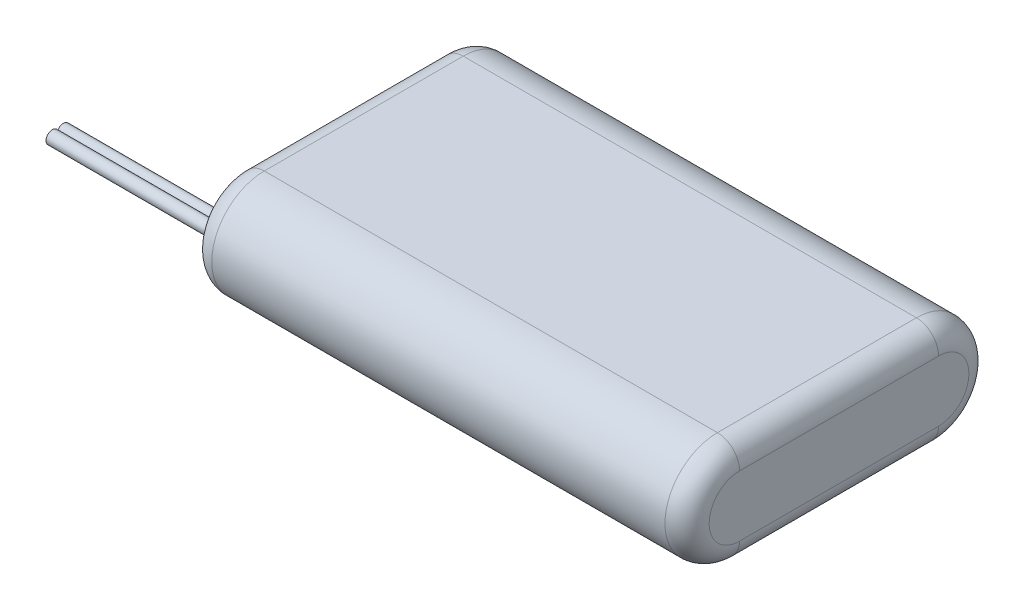
ISO-10303-21;
HEADER;
FILE_DESCRIPTION(('STEP AP214'),'2;1');
FILE_NAME('part.step','',(''),(''),'','','');
FILE_SCHEMA(('AUTOMOTIVE_DESIGN { 1 0 10303 214 1 1 1 1 }'));
ENDSEC;
DATA;
#1=APPLICATION_CONTEXT('core data for automotive mechanical design processes');
#2=APPLICATION_PROTOCOL_DEFINITION('international standard','automotive_design',2000,#1);
#3=PRODUCT_CONTEXT('',#1,'mechanical');
#4=PRODUCT('Part','Part','',(#3));
#5=PRODUCT_RELATED_PRODUCT_CATEGORY('part','',(#4));
#6=PRODUCT_DEFINITION_FORMATION('','',#4);
#7=PRODUCT_DEFINITION_CONTEXT('part definition',#1,'design');
#8=PRODUCT_DEFINITION('design','',#6,#7);
#9=PRODUCT_DEFINITION_SHAPE('','',#8);
#10=(LENGTH_UNIT() NAMED_UNIT(*) SI_UNIT(.MILLI.,.METRE.));
#11=(NAMED_UNIT(*) PLANE_ANGLE_UNIT() SI_UNIT($,.RADIAN.));
#12=(NAMED_UNIT(*) SI_UNIT($,.STERADIAN.) SOLID_ANGLE_UNIT());
#13=UNCERTAINTY_MEASURE_WITH_UNIT(LENGTH_MEASURE(1.E-05),#10,'distance_accuracy_value','');
#14=(GEOMETRIC_REPRESENTATION_CONTEXT(3) GLOBAL_UNCERTAINTY_ASSIGNED_CONTEXT((#13)) GLOBAL_UNIT_ASSIGNED_CONTEXT((#10,
#11,#12)) REPRESENTATION_CONTEXT('',''));
#15=CARTESIAN_POINT('',(0.,0.,0.));
#16=DIRECTION('',(0.,0.,1.));
#17=DIRECTION('',(1.,0.,0.));
#18=AXIS2_PLACEMENT_3D('',#15,#16,#17);
#19=CARTESIAN_POINT('',(22.5,0.,9.));
#20=DIRECTION('',(-1.,0.,0.));
#21=DIRECTION('',(0.,0.,1.));
#22=AXIS2_PLACEMENT_3D('',#19,#20,#21);
#23=CYLINDRICAL_SURFACE('',#22,4.75);
#24=DIRECTION('',(-1.,0.,0.));
#25=VECTOR('',#24,1.);
#26=CARTESIAN_POINT('',(22.5,4.75,9.));
#27=LINE('',#26,#25);
#28=CARTESIAN_POINT('',(20.5,4.75,9.));
#29=VERTEX_POINT('',#28);
#30=CARTESIAN_POINT('',(-20.5,4.75,9.));
#31=VERTEX_POINT('',#30);
#32=EDGE_CURVE('E135',#29,#31,#27,.T.);
#33=ORIENTED_EDGE('',*,*,#32,.T.);
#34=CARTESIAN_POINT('',(-20.5,0.,9.));
#35=DIRECTION('',(1.,0.,0.));
#36=DIRECTION('',(0.,0.,-1.));
#37=AXIS2_PLACEMENT_3D('',#34,#35,#36);
#38=CIRCLE('',#37,4.75);
#39=CARTESIAN_POINT('',(-20.5,-4.75,9.));
#40=VERTEX_POINT('',#39);
#41=EDGE_CURVE('E150',#31,#40,#38,.T.);
#42=ORIENTED_EDGE('',*,*,#41,.T.);
#43=DIRECTION('',(-1.,0.,0.));
#44=VECTOR('',#43,1.);
#45=CARTESIAN_POINT('',(22.5,-4.75,9.));
#46=LINE('',#45,#44);
#47=CARTESIAN_POINT('',(20.5,-4.75,9.));
#48=VERTEX_POINT('',#47);
#49=EDGE_CURVE('E145',#48,#40,#46,.T.);
#50=ORIENTED_EDGE('',*,*,#49,.F.);
#51=CARTESIAN_POINT('',(20.5,0.,9.));
#52=DIRECTION('',(1.,0.,0.));
#53=DIRECTION('',(0.,0.,-1.));
#54=AXIS2_PLACEMENT_3D('',#51,#52,#53);
#55=CIRCLE('',#54,4.75);
#56=EDGE_CURVE('E148',#48,#29,#55,.F.);
#57=ORIENTED_EDGE('',*,*,#56,.T.);
#58=EDGE_LOOP('',(#33,#42,#50,#57));
#59=FACE_BOUND('',#58,.T.);
#60=ADVANCED_FACE('F33',(#59),#23,.T.);
#61=CARTESIAN_POINT('',(22.5,-4.75,9.));
#62=DIRECTION('',(0.,1.,0.));
#63=DIRECTION('',(0.,0.,1.));
#64=AXIS2_PLACEMENT_3D('',#61,#62,#63);
#65=PLANE('',#64);
#66=DIRECTION('',(-1.,0.,0.));
#67=VECTOR('',#66,1.);
#68=CARTESIAN_POINT('',(22.5,-4.75,-9.));
#69=LINE('',#68,#67);
#70=CARTESIAN_POINT('',(20.5,-4.75,-9.));
#71=VERTEX_POINT('',#70);
#72=CARTESIAN_POINT('',(-20.5,-4.75,-9.));
#73=VERTEX_POINT('',#72);
#74=EDGE_CURVE('E142',#71,#73,#69,.T.);
#75=ORIENTED_EDGE('',*,*,#74,.F.);
#76=DIRECTION('',(0.,0.,-1.));
#77=VECTOR('',#76,1.);
#78=CARTESIAN_POINT('',(20.5,-4.75,9.));
#79=LINE('',#78,#77);
#80=EDGE_CURVE('E12',#71,#48,#79,.F.);
#81=ORIENTED_EDGE('',*,*,#80,.T.);
#82=ORIENTED_EDGE('',*,*,#49,.T.);
#83=DIRECTION('',(0.,0.,-1.));
#84=VECTOR('',#83,1.);
#85=CARTESIAN_POINT('',(-20.5,-4.75,9.));
#86=LINE('',#85,#84);
#87=EDGE_CURVE('E42',#40,#73,#86,.T.);
#88=ORIENTED_EDGE('',*,*,#87,.T.);
#89=EDGE_LOOP('',(#75,#81,#82,#88));
#90=FACE_BOUND('',#89,.T.);
#91=ADVANCED_FACE('F211',(#90),#65,.F.);
#92=CARTESIAN_POINT('',(22.5,0.,-9.));
#93=DIRECTION('',(-1.,0.,0.));
#94=DIRECTION('',(0.,0.,1.));
#95=AXIS2_PLACEMENT_3D('',#92,#93,#94);
#96=CYLINDRICAL_SURFACE('',#95,4.75);
#97=ORIENTED_EDGE('',*,*,#74,.T.);
#98=CARTESIAN_POINT('',(-20.5,0.,-9.));
#99=DIRECTION('',(1.,0.,0.));
#100=DIRECTION('',(0.,0.,-1.));
#101=AXIS2_PLACEMENT_3D('',#98,#99,#100);
#102=CIRCLE('',#101,4.75);
#103=CARTESIAN_POINT('',(-20.5,4.75,-9.));
#104=VERTEX_POINT('',#103);
#105=EDGE_CURVE('E170',#73,#104,#102,.T.);
#106=ORIENTED_EDGE('',*,*,#105,.T.);
#107=DIRECTION('',(-1.,0.,0.));
#108=VECTOR('',#107,1.);
#109=CARTESIAN_POINT('',(22.5,4.75,-9.));
#110=LINE('',#109,#108);
#111=CARTESIAN_POINT('',(20.5,4.75,-9.));
#112=VERTEX_POINT('',#111);
#113=EDGE_CURVE('E138',#112,#104,#110,.T.);
#114=ORIENTED_EDGE('',*,*,#113,.F.);
#115=CARTESIAN_POINT('',(20.5,0.,-9.));
#116=DIRECTION('',(1.,0.,0.));
#117=DIRECTION('',(0.,0.,-1.));
#118=AXIS2_PLACEMENT_3D('',#115,#116,#117);
#119=CIRCLE('',#118,4.75);
#120=EDGE_CURVE('E168',#112,#71,#119,.F.);
#121=ORIENTED_EDGE('',*,*,#120,.T.);
#122=EDGE_LOOP('',(#97,#106,#114,#121));
#123=FACE_BOUND('',#122,.T.);
#124=ADVANCED_FACE('F228',(#123),#96,.T.);
#125=CARTESIAN_POINT('',(22.5,4.75,9.));
#126=DIRECTION('',(0.,-1.,0.));
#127=DIRECTION('',(0.,0.,-1.));
#128=AXIS2_PLACEMENT_3D('',#125,#126,#127);
#129=PLANE('',#128);
#130=ORIENTED_EDGE('',*,*,#113,.T.);
#131=DIRECTION('',(0.,0.,1.));
#132=VECTOR('',#131,1.);
#133=CARTESIAN_POINT('',(-20.5,4.75,9.));
#134=LINE('',#133,#132);
#135=EDGE_CURVE('E166',#104,#31,#134,.T.);
#136=ORIENTED_EDGE('',*,*,#135,.T.);
#137=ORIENTED_EDGE('',*,*,#32,.F.);
#138=DIRECTION('',(0.,0.,1.));
#139=VECTOR('',#138,1.);
#140=CARTESIAN_POINT('',(20.5,4.75,-9.));
#141=LINE('',#140,#139);
#142=EDGE_CURVE('E163',#29,#112,#141,.F.);
#143=ORIENTED_EDGE('',*,*,#142,.T.);
#144=EDGE_LOOP('',(#130,#136,#137,#143));
#145=FACE_BOUND('',#144,.T.);
#146=ADVANCED_FACE('F238',(#145),#129,.F.);
#147=CARTESIAN_POINT('',(22.5,0.,9.));
#148=DIRECTION('',(1.,0.,0.));
#149=DIRECTION('',(0.,0.,-1.));
#150=AXIS2_PLACEMENT_3D('',#147,#148,#149);
#151=PLANE('',#150);
#152=CARTESIAN_POINT('',(22.5,0.,-9.));
#153=DIRECTION('',(1.,0.,0.));
#154=DIRECTION('',(0.,0.,-1.));
#155=AXIS2_PLACEMENT_3D('',#152,#153,#154);
#156=CIRCLE('',#155,2.75);
#157=CARTESIAN_POINT('',(22.5,-2.75,-9.));
#158=VERTEX_POINT('',#157);
#159=CARTESIAN_POINT('',(22.5,2.75,-9.));
#160=VERTEX_POINT('',#159);
#161=EDGE_CURVE('E176',#158,#160,#156,.T.);
#162=ORIENTED_EDGE('',*,*,#161,.T.);
#163=DIRECTION('',(0.,0.,1.));
#164=VECTOR('',#163,1.);
#165=CARTESIAN_POINT('',(22.5,2.75,9.));
#166=LINE('',#165,#164);
#167=CARTESIAN_POINT('',(22.5,2.75,9.));
#168=VERTEX_POINT('',#167);
#169=EDGE_CURVE('E178',#160,#168,#166,.T.);
#170=ORIENTED_EDGE('',*,*,#169,.T.);
#171=CARTESIAN_POINT('',(22.5,0.,9.));
#172=DIRECTION('',(1.,0.,0.));
#173=DIRECTION('',(0.,0.,-1.));
#174=AXIS2_PLACEMENT_3D('',#171,#172,#173);
#175=CIRCLE('',#174,2.75);
#176=CARTESIAN_POINT('',(22.5,-2.74999999999999,9.));
#177=VERTEX_POINT('',#176);
#178=EDGE_CURVE('E172',#168,#177,#175,.T.);
#179=ORIENTED_EDGE('',*,*,#178,.T.);
#180=DIRECTION('',(0.,0.,-1.));
#181=VECTOR('',#180,1.);
#182=CARTESIAN_POINT('',(22.5,-2.75,-9.));
#183=LINE('',#182,#181);
#184=EDGE_CURVE('E174',#177,#158,#183,.T.);
#185=ORIENTED_EDGE('',*,*,#184,.T.);
#186=EDGE_LOOP('',(#162,#170,#179,#185));
#187=FACE_BOUND('',#186,.T.);
#188=ADVANCED_FACE('F246',(#187),#151,.T.);
#189=CARTESIAN_POINT('',(-22.5,0.,9.));
#190=DIRECTION('',(1.,0.,0.));
#191=DIRECTION('',(0.,0.,-1.));
#192=AXIS2_PLACEMENT_3D('',#189,#190,#191);
#193=PLANE('',#192);
#194=CARTESIAN_POINT('',(-22.5,0.,11.175));
#195=DIRECTION('',(-1.,0.,0.));
#196=DIRECTION('',(0.,0.,1.));
#197=AXIS2_PLACEMENT_3D('',#194,#195,#196);
#198=CIRCLE('',#197,0.575);
#199=CARTESIAN_POINT('',(-22.5,-0.283945417290013,10.675));
#200=VERTEX_POINT('',#199);
#201=CARTESIAN_POINT('',(-22.5,0.,11.75));
#202=VERTEX_POINT('',#201);
#203=EDGE_CURVE('E382',#200,#202,#198,.T.);
#204=ORIENTED_EDGE('',*,*,#203,.F.);
#205=CARTESIAN_POINT('',(-22.5,0.,10.175));
#206=DIRECTION('',(-1.,0.,0.));
#207=DIRECTION('',(0.,0.,1.));
#208=AXIS2_PLACEMENT_3D('',#205,#206,#207);
#209=CIRCLE('',#208,0.575);
#210=CARTESIAN_POINT('',(-22.5,0.283945417290013,10.675));
#211=VERTEX_POINT('',#210);
#212=EDGE_CURVE('E50',#211,#200,#209,.T.);
#213=ORIENTED_EDGE('',*,*,#212,.F.);
#214=EDGE_CURVE('E54',#202,#211,#198,.T.);
#215=ORIENTED_EDGE('',*,*,#214,.F.);
#216=CARTESIAN_POINT('',(-22.5,0.,9.));
#217=DIRECTION('',(1.,0.,0.));
#218=DIRECTION('',(0.,0.,-1.));
#219=AXIS2_PLACEMENT_3D('',#216,#217,#218);
#220=CIRCLE('',#219,2.75);
#221=CARTESIAN_POINT('',(-22.5,2.75,9.));
#222=VERTEX_POINT('',#221);
#223=EDGE_CURVE('E159',#202,#222,#220,.F.);
#224=ORIENTED_EDGE('',*,*,#223,.T.);
#225=DIRECTION('',(0.,0.,1.));
#226=VECTOR('',#225,1.);
#227=CARTESIAN_POINT('',(-22.5,2.75,9.));
#228=LINE('',#227,#226);
#229=CARTESIAN_POINT('',(-22.5,2.75,-9.));
#230=VERTEX_POINT('',#229);
#231=EDGE_CURVE('E157',#222,#230,#228,.F.);
#232=ORIENTED_EDGE('',*,*,#231,.T.);
#233=CARTESIAN_POINT('',(-22.5,0.,-9.));
#234=DIRECTION('',(1.,0.,0.));
#235=DIRECTION('',(0.,0.,-1.));
#236=AXIS2_PLACEMENT_3D('',#233,#234,#235);
#237=CIRCLE('',#236,2.75);
#238=CARTESIAN_POINT('',(-22.5,-2.75,-9.));
#239=VERTEX_POINT('',#238);
#240=EDGE_CURVE('E155',#230,#239,#237,.F.);
#241=ORIENTED_EDGE('',*,*,#240,.T.);
#242=DIRECTION('',(0.,0.,-1.));
#243=VECTOR('',#242,1.);
#244=CARTESIAN_POINT('',(-22.5,-2.75,9.));
#245=LINE('',#244,#243);
#246=CARTESIAN_POINT('',(-22.5,-2.75,9.));
#247=VERTEX_POINT('',#246);
#248=EDGE_CURVE('E153',#239,#247,#245,.F.);
#249=ORIENTED_EDGE('',*,*,#248,.T.);
#250=EDGE_CURVE('E160',#247,#202,#220,.F.);
#251=ORIENTED_EDGE('',*,*,#250,.T.);
#252=EDGE_LOOP('',(#204,#213,#215,#224,#232,#241,#249,#251));
#253=FACE_BOUND('',#252,.T.);
#254=ADVANCED_FACE('F248',(#253),#193,.F.);
#255=CARTESIAN_POINT('',(-20.5,0.,-9.));
#256=DIRECTION('',(1.,0.,0.));
#257=DIRECTION('',(0.,0.,-1.));
#258=AXIS2_PLACEMENT_3D('',#255,#256,#257);
#259=TOROIDAL_SURFACE('',#258,2.75,2.);
#260=CARTESIAN_POINT('',(-20.5,-2.75,-9.));
#261=DIRECTION('',(0.,0.,1.));
#262=DIRECTION('',(1.,0.,0.));
#263=AXIS2_PLACEMENT_3D('',#260,#261,#262);
#264=CIRCLE('',#263,2.);
#265=EDGE_CURVE('E187',#239,#73,#264,.T.);
#266=ORIENTED_EDGE('',*,*,#265,.F.);
#267=ORIENTED_EDGE('',*,*,#240,.F.);
#268=CARTESIAN_POINT('',(-20.5,2.75,-9.));
#269=DIRECTION('',(0.,0.,1.));
#270=DIRECTION('',(1.,0.,0.));
#271=AXIS2_PLACEMENT_3D('',#268,#269,#270);
#272=CIRCLE('',#271,2.);
#273=EDGE_CURVE('E139',#104,#230,#272,.T.);
#274=ORIENTED_EDGE('',*,*,#273,.F.);
#275=ORIENTED_EDGE('',*,*,#105,.F.);
#276=EDGE_LOOP('',(#266,#267,#274,#275));
#277=FACE_BOUND('',#276,.T.);
#278=ADVANCED_FACE('F232',(#277),#259,.T.);
#279=CARTESIAN_POINT('',(-20.5,2.75,9.));
#280=DIRECTION('',(0.,0.,1.));
#281=DIRECTION('',(1.,0.,0.));
#282=AXIS2_PLACEMENT_3D('',#279,#280,#281);
#283=CYLINDRICAL_SURFACE('',#282,2.);
#284=ORIENTED_EDGE('',*,*,#273,.T.);
#285=ORIENTED_EDGE('',*,*,#231,.F.);
#286=CARTESIAN_POINT('',(-20.5,2.75,9.));
#287=DIRECTION('',(0.,0.,1.));
#288=DIRECTION('',(1.,0.,0.));
#289=AXIS2_PLACEMENT_3D('',#286,#287,#288);
#290=CIRCLE('',#289,2.);
#291=EDGE_CURVE('E184',#31,#222,#290,.T.);
#292=ORIENTED_EDGE('',*,*,#291,.F.);
#293=ORIENTED_EDGE('',*,*,#135,.F.);
#294=EDGE_LOOP('',(#284,#285,#292,#293));
#295=FACE_BOUND('',#294,.T.);
#296=ADVANCED_FACE('F236',(#295),#283,.T.);
#297=CARTESIAN_POINT('',(-20.5,-2.75,9.));
#298=DIRECTION('',(0.,0.,-1.));
#299=DIRECTION('',(-1.,0.,0.));
#300=AXIS2_PLACEMENT_3D('',#297,#298,#299);
#301=CYLINDRICAL_SURFACE('',#300,2.);
#302=ORIENTED_EDGE('',*,*,#265,.T.);
#303=ORIENTED_EDGE('',*,*,#87,.F.);
#304=CARTESIAN_POINT('',(-20.5,-2.75,9.));
#305=DIRECTION('',(0.,0.,1.));
#306=DIRECTION('',(1.,0.,0.));
#307=AXIS2_PLACEMENT_3D('',#304,#305,#306);
#308=CIRCLE('',#307,2.);
#309=EDGE_CURVE('E182',#247,#40,#308,.T.);
#310=ORIENTED_EDGE('',*,*,#309,.F.);
#311=ORIENTED_EDGE('',*,*,#248,.F.);
#312=EDGE_LOOP('',(#302,#303,#310,#311));
#313=FACE_BOUND('',#312,.T.);
#314=ADVANCED_FACE('F224',(#313),#301,.T.);
#315=CARTESIAN_POINT('',(-20.5,0.,9.));
#316=DIRECTION('',(1.,0.,0.));
#317=DIRECTION('',(0.,0.,-1.));
#318=AXIS2_PLACEMENT_3D('',#315,#316,#317);
#319=TOROIDAL_SURFACE('',#318,2.75,2.);
#320=ORIENTED_EDGE('',*,*,#291,.T.);
#321=ORIENTED_EDGE('',*,*,#223,.F.);
#322=ORIENTED_EDGE('',*,*,#250,.F.);
#323=ORIENTED_EDGE('',*,*,#309,.T.);
#324=ORIENTED_EDGE('',*,*,#41,.F.);
#325=EDGE_LOOP('',(#320,#321,#322,#323,#324));
#326=FACE_BOUND('',#325,.T.);
#327=ADVANCED_FACE('F217',(#326),#319,.T.);
#328=CARTESIAN_POINT('',(20.5,-2.75,9.));
#329=DIRECTION('',(0.,0.,1.));
#330=DIRECTION('',(1.,0.,0.));
#331=AXIS2_PLACEMENT_3D('',#328,#329,#330);
#332=CYLINDRICAL_SURFACE('',#331,2.);
#333=CARTESIAN_POINT('',(20.5,-2.75,9.));
#334=DIRECTION('',(0.,0.,1.));
#335=DIRECTION('',(1.,0.,0.));
#336=AXIS2_PLACEMENT_3D('',#333,#334,#335);
#337=CIRCLE('',#336,2.);
#338=EDGE_CURVE('E192',#48,#177,#337,.T.);
#339=ORIENTED_EDGE('',*,*,#338,.F.);
#340=ORIENTED_EDGE('',*,*,#80,.F.);
#341=CARTESIAN_POINT('',(20.5,-2.75,-9.));
#342=DIRECTION('',(0.,0.,-1.));
#343=DIRECTION('',(-1.,0.,0.));
#344=AXIS2_PLACEMENT_3D('',#341,#342,#343);
#345=CIRCLE('',#344,2.);
#346=EDGE_CURVE('E37',#158,#71,#345,.T.);
#347=ORIENTED_EDGE('',*,*,#346,.F.);
#348=ORIENTED_EDGE('',*,*,#184,.F.);
#349=EDGE_LOOP('',(#339,#340,#347,#348));
#350=FACE_BOUND('',#349,.T.);
#351=ADVANCED_FACE('F35',(#350),#332,.T.);
#352=CARTESIAN_POINT('',(20.5,0.,-9.));
#353=DIRECTION('',(1.,0.,0.));
#354=DIRECTION('',(0.,0.,-1.));
#355=AXIS2_PLACEMENT_3D('',#352,#353,#354);
#356=TOROIDAL_SURFACE('',#355,2.75,2.);
#357=ORIENTED_EDGE('',*,*,#346,.T.);
#358=ORIENTED_EDGE('',*,*,#120,.F.);
#359=CARTESIAN_POINT('',(20.5,2.75,-9.));
#360=DIRECTION('',(0.,0.,1.));
#361=DIRECTION('',(1.,0.,0.));
#362=AXIS2_PLACEMENT_3D('',#359,#360,#361);
#363=CIRCLE('',#362,2.);
#364=EDGE_CURVE('E130',#160,#112,#363,.T.);
#365=ORIENTED_EDGE('',*,*,#364,.F.);
#366=ORIENTED_EDGE('',*,*,#161,.F.);
#367=EDGE_LOOP('',(#357,#358,#365,#366));
#368=FACE_BOUND('',#367,.T.);
#369=ADVANCED_FACE('F203',(#368),#356,.T.);
#370=CARTESIAN_POINT('',(20.5,0.,9.));
#371=DIRECTION('',(1.,0.,0.));
#372=DIRECTION('',(0.,0.,-1.));
#373=AXIS2_PLACEMENT_3D('',#370,#371,#372);
#374=TOROIDAL_SURFACE('',#373,2.75,2.);
#375=ORIENTED_EDGE('',*,*,#338,.T.);
#376=ORIENTED_EDGE('',*,*,#178,.F.);
#377=CARTESIAN_POINT('',(20.5,2.75,9.));
#378=DIRECTION('',(0.,0.,-1.));
#379=DIRECTION('',(-1.,0.,0.));
#380=AXIS2_PLACEMENT_3D('',#377,#378,#379);
#381=CIRCLE('',#380,2.);
#382=EDGE_CURVE('E128',#29,#168,#381,.T.);
#383=ORIENTED_EDGE('',*,*,#382,.F.);
#384=ORIENTED_EDGE('',*,*,#56,.F.);
#385=EDGE_LOOP('',(#375,#376,#383,#384));
#386=FACE_BOUND('',#385,.T.);
#387=ADVANCED_FACE('F244',(#386),#374,.T.);
#388=CARTESIAN_POINT('',(20.5,2.75,9.));
#389=DIRECTION('',(0.,0.,-1.));
#390=DIRECTION('',(-1.,0.,0.));
#391=AXIS2_PLACEMENT_3D('',#388,#389,#390);
#392=CYLINDRICAL_SURFACE('',#391,2.);
#393=ORIENTED_EDGE('',*,*,#364,.T.);
#394=ORIENTED_EDGE('',*,*,#142,.F.);
#395=ORIENTED_EDGE('',*,*,#382,.T.);
#396=ORIENTED_EDGE('',*,*,#169,.F.);
#397=EDGE_LOOP('',(#393,#394,#395,#396));
#398=FACE_BOUND('',#397,.T.);
#399=ADVANCED_FACE('F242',(#398),#392,.T.);
#400=CARTESIAN_POINT('',(-37.5,0.,11.175));
#401=DIRECTION('',(1.,0.,0.));
#402=DIRECTION('',(0.,0.,-1.));
#403=AXIS2_PLACEMENT_3D('',#400,#401,#402);
#404=CYLINDRICAL_SURFACE('',#403,0.575);
#405=ORIENTED_EDGE('',*,*,#203,.T.);
#406=ORIENTED_EDGE('',*,*,#214,.T.);
#407=DIRECTION('',(1.,0.,0.));
#408=VECTOR('',#407,1.);
#409=CARTESIAN_POINT('',(-37.5,0.283945417290013,10.675));
#410=LINE('',#409,#408);
#411=CARTESIAN_POINT('',(-37.5,0.283945417290013,10.675));
#412=VERTEX_POINT('',#411);
#413=EDGE_CURVE('E116',#412,#211,#410,.T.);
#414=ORIENTED_EDGE('',*,*,#413,.F.);
#415=CARTESIAN_POINT('',(-37.5,0.,11.175));
#416=DIRECTION('',(-1.,0.,0.));
#417=DIRECTION('',(0.,0.,1.));
#418=AXIS2_PLACEMENT_3D('',#415,#416,#417);
#419=CIRCLE('',#418,0.575);
#420=CARTESIAN_POINT('',(-37.5,-0.283945417290013,10.675));
#421=VERTEX_POINT('',#420);
#422=EDGE_CURVE('E121',#421,#412,#419,.T.);
#423=ORIENTED_EDGE('',*,*,#422,.F.);
#424=DIRECTION('',(1.,0.,0.));
#425=VECTOR('',#424,1.);
#426=CARTESIAN_POINT('',(-37.5,-0.283945417290013,10.675));
#427=LINE('',#426,#425);
#428=EDGE_CURVE('E118',#421,#200,#427,.T.);
#429=ORIENTED_EDGE('',*,*,#428,.T.);
#430=EDGE_LOOP('',(#405,#406,#414,#423,#429));
#431=FACE_BOUND('',#430,.T.);
#432=ADVANCED_FACE('F127',(#431),#404,.T.);
#433=CARTESIAN_POINT('',(-37.5,0.,10.175));
#434=DIRECTION('',(1.,0.,0.));
#435=DIRECTION('',(0.,0.,-1.));
#436=AXIS2_PLACEMENT_3D('',#433,#434,#435);
#437=CYLINDRICAL_SURFACE('',#436,0.575);
#438=ORIENTED_EDGE('',*,*,#212,.T.);
#439=ORIENTED_EDGE('',*,*,#428,.F.);
#440=CARTESIAN_POINT('',(-37.5,0.,10.175));
#441=DIRECTION('',(-1.,0.,0.));
#442=DIRECTION('',(0.,0.,1.));
#443=AXIS2_PLACEMENT_3D('',#440,#441,#442);
#444=CIRCLE('',#443,0.575);
#445=EDGE_CURVE('E112',#412,#421,#444,.T.);
#446=ORIENTED_EDGE('',*,*,#445,.F.);
#447=ORIENTED_EDGE('',*,*,#413,.T.);
#448=EDGE_LOOP('',(#438,#439,#446,#447));
#449=FACE_BOUND('',#448,.T.);
#450=ADVANCED_FACE('F114',(#449),#437,.T.);
#451=CARTESIAN_POINT('',(-37.5,0.,10.675));
#452=DIRECTION('',(-1.,0.,0.));
#453=DIRECTION('',(0.,0.,1.));
#454=AXIS2_PLACEMENT_3D('',#451,#452,#453);
#455=PLANE('',#454);
#456=ORIENTED_EDGE('',*,*,#422,.T.);
#457=ORIENTED_EDGE('',*,*,#445,.T.);
#458=EDGE_LOOP('',(#456,#457));
#459=FACE_BOUND('',#458,.T.);
#460=ADVANCED_FACE('F123',(#459),#455,.T.);
#461=CLOSED_SHELL('',(#60,#91,#124,#146,#188,#254,#278,#296,#314,#327,#351,#369,#387,#399,#432,
#450,#460));
#462=MANIFOLD_SOLID_BREP('B2',#461);
#463=ADVANCED_BREP_SHAPE_REPRESENTATION('',(#18,#462),#14);
#464=SHAPE_DEFINITION_REPRESENTATION(#9,#463);
ENDSEC;
END-ISO-10303-21;
